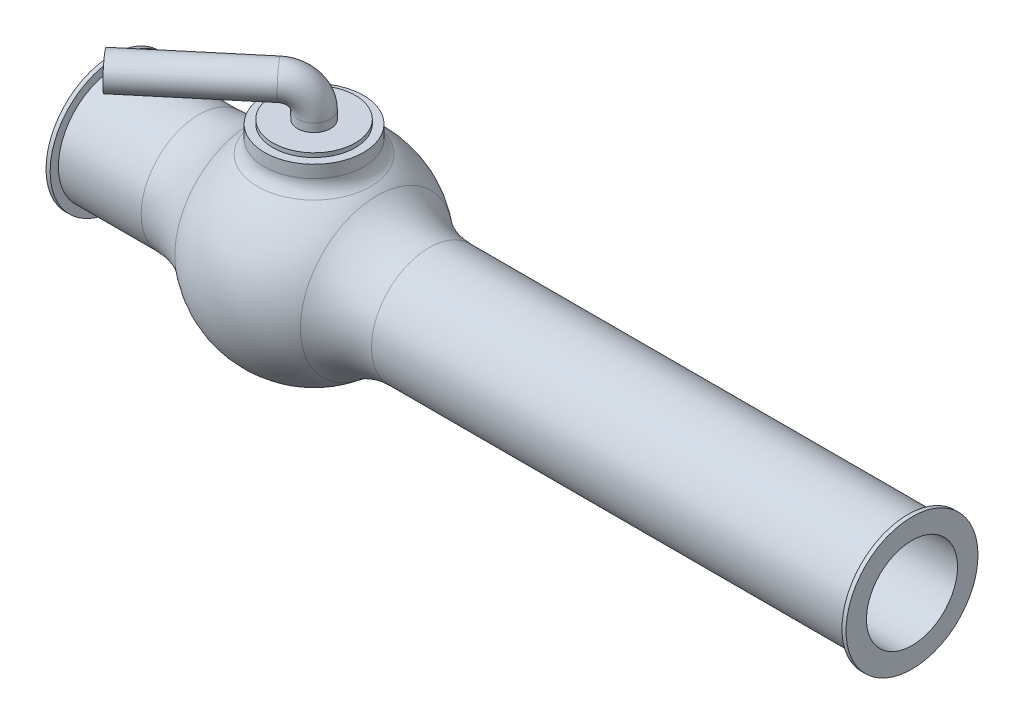
ISO-10303-21;
HEADER;
FILE_DESCRIPTION(('STEP AP214'),'2;1');
FILE_NAME('part.step','',(''),(''),'','','');
FILE_SCHEMA(('AUTOMOTIVE_DESIGN { 1 0 10303 214 1 1 1 1 }'));
ENDSEC;
DATA;
#1=APPLICATION_CONTEXT('core data for automotive mechanical design processes');
#2=APPLICATION_PROTOCOL_DEFINITION('international standard','automotive_design',2000,#1);
#3=PRODUCT_CONTEXT('',#1,'mechanical');
#4=PRODUCT('Part','Part','',(#3));
#5=PRODUCT_RELATED_PRODUCT_CATEGORY('part','',(#4));
#6=PRODUCT_DEFINITION_FORMATION('','',#4);
#7=PRODUCT_DEFINITION_CONTEXT('part definition',#1,'design');
#8=PRODUCT_DEFINITION('design','',#6,#7);
#9=PRODUCT_DEFINITION_SHAPE('','',#8);
#10=(LENGTH_UNIT() NAMED_UNIT(*) SI_UNIT(.MILLI.,.METRE.));
#11=(NAMED_UNIT(*) PLANE_ANGLE_UNIT() SI_UNIT($,.RADIAN.));
#12=(NAMED_UNIT(*) SI_UNIT($,.STERADIAN.) SOLID_ANGLE_UNIT());
#13=UNCERTAINTY_MEASURE_WITH_UNIT(LENGTH_MEASURE(1.E-05),#10,'distance_accuracy_value','');
#14=(GEOMETRIC_REPRESENTATION_CONTEXT(3) GLOBAL_UNCERTAINTY_ASSIGNED_CONTEXT((#13)) GLOBAL_UNIT_ASSIGNED_CONTEXT((#10,
#11,#12)) REPRESENTATION_CONTEXT('',''));
#15=CARTESIAN_POINT('',(0.,0.,0.));
#16=DIRECTION('',(0.,0.,1.));
#17=DIRECTION('',(1.,0.,0.));
#18=AXIS2_PLACEMENT_3D('',#15,#16,#17);
#19=CARTESIAN_POINT('',(0.,0.,0.));
#20=DIRECTION('',(0.,1.,0.));
#21=DIRECTION('',(0.,0.,-1.));
#22=AXIS2_PLACEMENT_3D('',#19,#20,#21);
#23=SPHERICAL_SURFACE('',#22,120.);
#24=CARTESIAN_POINT('',(0.,98.4782167977948,0.));
#25=DIRECTION('',(0.,-1.,0.));
#26=DIRECTION('',(0.,0.,-1.));
#27=AXIS2_PLACEMENT_3D('',#24,#25,#26);
#28=CIRCLE('',#27,68.5714285714286);
#29=CARTESIAN_POINT('',(0.,98.4782167977948,-68.5714285714286));
#30=VERTEX_POINT('',#29);
#31=EDGE_CURVE('E11',#30,#30,#28,.T.);
#32=ORIENTED_EDGE('',*,*,#31,.T.);
#33=EDGE_LOOP('',(#32));
#34=FACE_BOUND('',#33,.T.);
#35=CARTESIAN_POINT('',(76.1685820569215,0.,0.));
#36=DIRECTION('',(-1.,0.,0.));
#37=DIRECTION('',(0.,0.,1.));
#38=AXIS2_PLACEMENT_3D('',#35,#36,#37);
#39=CIRCLE('',#38,92.7272727272727);
#40=CARTESIAN_POINT('',(76.1685820569215,0.,92.7272727272727));
#41=VERTEX_POINT('',#40);
#42=EDGE_CURVE('E88',#41,#41,#39,.T.);
#43=ORIENTED_EDGE('',*,*,#42,.T.);
#44=EDGE_LOOP('',(#43));
#45=FACE_BOUND('',#44,.T.);
#46=CARTESIAN_POINT('',(-76.1685820569215,0.,0.));
#47=DIRECTION('',(1.,0.,0.));
#48=DIRECTION('',(0.,0.,-1.));
#49=AXIS2_PLACEMENT_3D('',#46,#47,#48);
#50=CIRCLE('',#49,92.7272727272727);
#51=CARTESIAN_POINT('',(-76.1685820569215,0.,-92.7272727272727));
#52=VERTEX_POINT('',#51);
#53=EDGE_CURVE('E81',#52,#52,#50,.T.);
#54=ORIENTED_EDGE('',*,*,#53,.T.);
#55=EDGE_LOOP('',(#54));
#56=FACE_BOUND('',#55,.T.);
#57=ADVANCED_FACE('F32',(#34,#45,#56),#23,.T.);
#58=CARTESIAN_POINT('',(0.,0.,0.));
#59=DIRECTION('',(0.,1.,0.));
#60=DIRECTION('',(0.,0.,-1.));
#61=AXIS2_PLACEMENT_3D('',#58,#59,#60);
#62=SPHERICAL_SURFACE('',#61,100.);
#63=CARTESIAN_POINT('',(-83.3885822273715,0.,0.));
#64=DIRECTION('',(1.,0.,0.));
#65=DIRECTION('',(0.,0.,-1.));
#66=AXIS2_PLACEMENT_3D('',#63,#64,#65);
#67=CIRCLE('',#66,55.1936985);
#68=CARTESIAN_POINT('',(-83.3885822273715,-46.099495348784,30.3509618084227));
#69=VERTEX_POINT('',#68);
#70=CARTESIAN_POINT('',(-83.3885822273715,46.0994953487841,30.3509618084227));
#71=VERTEX_POINT('',#70);
#72=EDGE_CURVE('E46',#69,#71,#67,.F.);
#73=ORIENTED_EDGE('',*,*,#72,.T.);
#74=CARTESIAN_POINT('',(-63.879360034848,0.,53.6011474450814));
#75=DIRECTION('',(0.766044443118979,0.,-0.642787609686538));
#76=DIRECTION('',(-0.642787609686538,0.,-0.766044443118979));
#77=AXIS2_PLACEMENT_3D('',#74,#75,#76);
#78=CIRCLE('',#77,55.1936985);
#79=EDGE_CURVE('E68',#71,#69,#78,.T.);
#80=ORIENTED_EDGE('',*,*,#79,.T.);
#81=EDGE_LOOP('',(#73,#80));
#82=FACE_BOUND('',#81,.T.);
#83=ADVANCED_FACE('F76',(#82),#62,.F.);
#84=CARTESIAN_POINT('',(0.,135.,0.));
#85=DIRECTION('',(0.,1.,0.));
#86=DIRECTION('',(0.,0.,1.));
#87=AXIS2_PLACEMENT_3D('',#84,#85,#86);
#88=PLANE('',#87);
#89=CARTESIAN_POINT('',(0.,135.,0.));
#90=DIRECTION('',(0.,1.,0.));
#91=DIRECTION('',(0.,0.,1.));
#92=AXIS2_PLACEMENT_3D('',#89,#90,#91);
#93=CIRCLE('',#92,50.);
#94=CARTESIAN_POINT('',(0.,135.,50.));
#95=VERTEX_POINT('',#94);
#96=EDGE_CURVE('E195',#95,#95,#93,.T.);
#97=ORIENTED_EDGE('',*,*,#96,.T.);
#98=EDGE_LOOP('',(#97));
#99=FACE_BOUND('',#98,.T.);
#100=CARTESIAN_POINT('',(0.,135.,0.));
#101=DIRECTION('',(0.,1.,0.));
#102=DIRECTION('',(0.,0.,1.));
#103=AXIS2_PLACEMENT_3D('',#100,#101,#102);
#104=CIRCLE('',#103,20.);
#105=CARTESIAN_POINT('',(0.,135.,20.));
#106=VERTEX_POINT('',#105);
#107=EDGE_CURVE('E184',#106,#106,#104,.T.);
#108=ORIENTED_EDGE('',*,*,#107,.F.);
#109=EDGE_LOOP('',(#108));
#110=FACE_BOUND('',#109,.T.);
#111=ADVANCED_FACE('F114',(#99,#110),#88,.T.);
#112=CARTESIAN_POINT('',(0.,135.,0.));
#113=DIRECTION('',(0.,-1.,0.));
#114=DIRECTION('',(0.,0.,-1.));
#115=AXIS2_PLACEMENT_3D('',#112,#113,#114);
#116=CYLINDRICAL_SURFACE('',#115,50.);
#117=ORIENTED_EDGE('',*,*,#96,.F.);
#118=EDGE_LOOP('',(#117));
#119=FACE_BOUND('',#118,.T.);
#120=CARTESIAN_POINT('',(0.,130.,0.));
#121=DIRECTION('',(0.,1.,0.));
#122=DIRECTION('',(0.,0.,1.));
#123=AXIS2_PLACEMENT_3D('',#120,#121,#122);
#124=CIRCLE('',#123,50.);
#125=CARTESIAN_POINT('',(0.,130.,50.));
#126=VERTEX_POINT('',#125);
#127=EDGE_CURVE('E181',#126,#126,#124,.T.);
#128=ORIENTED_EDGE('',*,*,#127,.T.);
#129=EDGE_LOOP('',(#128));
#130=FACE_BOUND('',#129,.T.);
#131=ADVANCED_FACE('F142',(#119,#130),#116,.T.);
#132=CARTESIAN_POINT('',(-22.9813332935695,175.,19.2836282905961));
#133=DIRECTION('',(-0.766044443118981,0.,0.642787609686535));
#134=DIRECTION('',(0.642787609686535,0.,0.766044443118982));
#135=AXIS2_PLACEMENT_3D('',#132,#133,#134);
#136=CYLINDRICAL_SURFACE('',#135,20.);
#137=CARTESIAN_POINT('',(-22.9813332935695,175.,19.2836282905961));
#138=DIRECTION('',(-0.766044443118982,0.,0.642787609686535));
#139=DIRECTION('',(0.492403876506103,-0.642787609686535,0.586824088833471));
#140=AXIS2_PLACEMENT_3D('',#137,#138,#139);
#141=CIRCLE('',#140,20.);
#142=CARTESIAN_POINT('',(-22.9813332935695,195.,19.2836282905961));
#143=VERTEX_POINT('',#142);
#144=EDGE_CURVE('E188',#143,#143,#141,.T.);
#145=ORIENTED_EDGE('',*,*,#144,.T.);
#146=EDGE_LOOP('',(#145));
#147=FACE_BOUND('',#146,.T.);
#148=CARTESIAN_POINT('',(-137.887999761417,175.,115.701769743576));
#149=DIRECTION('',(-0.766044443118982,0.,0.642787609686535));
#150=DIRECTION('',(0.492403876506103,-0.642787609686535,0.586824088833471));
#151=AXIS2_PLACEMENT_3D('',#148,#149,#150);
#152=CIRCLE('',#151,20.);
#153=CARTESIAN_POINT('',(-128.039922231295,162.144247806269,127.438251520246));
#154=VERTEX_POINT('',#153);
#155=EDGE_CURVE('E193',#154,#154,#152,.T.);
#156=ORIENTED_EDGE('',*,*,#155,.F.);
#157=EDGE_LOOP('',(#156));
#158=FACE_BOUND('',#157,.T.);
#159=ADVANCED_FACE('F138',(#147,#158),#136,.T.);
#160=CARTESIAN_POINT('',(-22.9813332935694,145.,19.2836282905961));
#161=DIRECTION('',(0.642787609686535,0.,0.766044443118982));
#162=DIRECTION('',(0.766044443118982,0.,-0.642787609686535));
#163=AXIS2_PLACEMENT_3D('',#160,#161,#162);
#164=TOROIDAL_SURFACE('',#163,30.,20.);
#165=CARTESIAN_POINT('',(0.,145.,0.));
#166=DIRECTION('',(0.,1.,0.));
#167=DIRECTION('',(0.,0.,1.));
#168=AXIS2_PLACEMENT_3D('',#165,#166,#167);
#169=CIRCLE('',#168,20.);
#170=CARTESIAN_POINT('',(15.3208888623796,145.,-12.8557521937307));
#171=VERTEX_POINT('',#170);
#172=EDGE_CURVE('E185',#171,#171,#169,.T.);
#173=CARTESIAN_POINT('',(-22.9813332935694,145.,19.2836282905961));
#174=DIRECTION('',(0.642787609686535,0.,0.766044443118982));
#175=DIRECTION('',(0.766044443118982,0.,-0.642787609686535));
#176=AXIS2_PLACEMENT_3D('',#173,#174,#175);
#177=CIRCLE('',#176,50.);
#178=EDGE_CURVE('',#171,#143,#177,.T.);
#179=ORIENTED_EDGE('',*,*,#172,.T.);
#180=ORIENTED_EDGE('',*,*,#144,.F.);
#181=ORIENTED_EDGE('',*,*,#178,.T.);
#182=ORIENTED_EDGE('',*,*,#178,.F.);
#183=EDGE_LOOP('',(#179,#181,#180,#182));
#184=FACE_BOUND('',#183,.T.);
#185=ADVANCED_FACE('F134',(#184),#164,.T.);
#186=CARTESIAN_POINT('',(0.,145.,0.));
#187=DIRECTION('',(0.,-1.,0.));
#188=DIRECTION('',(0.,0.,-1.));
#189=AXIS2_PLACEMENT_3D('',#186,#187,#188);
#190=CYLINDRICAL_SURFACE('',#189,20.);
#191=ORIENTED_EDGE('',*,*,#172,.F.);
#192=EDGE_LOOP('',(#191));
#193=FACE_BOUND('',#192,.T.);
#194=ORIENTED_EDGE('',*,*,#107,.T.);
#195=EDGE_LOOP('',(#194));
#196=FACE_BOUND('',#195,.T.);
#197=ADVANCED_FACE('F130',(#193,#196),#190,.T.);
#198=CARTESIAN_POINT('',(-137.887999761417,175.,115.701769743576));
#199=DIRECTION('',(-0.766044443118982,0.,0.642787609686535));
#200=DIRECTION('',(0.492403876506103,-0.642787609686535,0.586824088833471));
#201=AXIS2_PLACEMENT_3D('',#198,#199,#200);
#202=PLANE('',#201);
#203=ORIENTED_EDGE('',*,*,#155,.T.);
#204=EDGE_LOOP('',(#203));
#205=FACE_BOUND('',#204,.T.);
#206=ADVANCED_FACE('F123',(#205),#202,.T.);
#207=CARTESIAN_POINT('',(0.,180.,0.));
#208=DIRECTION('',(0.,1.,0.));
#209=DIRECTION('',(0.,0.,1.));
#210=AXIS2_PLACEMENT_3D('',#207,#208,#209);
#211=CYLINDRICAL_SURFACE('',#210,60.);
#212=CARTESIAN_POINT('',(0.,114.891252930761,0.));
#213=DIRECTION('',(0.,-1.,0.));
#214=DIRECTION('',(0.,0.,-1.));
#215=AXIS2_PLACEMENT_3D('',#212,#213,#214);
#216=CIRCLE('',#215,60.);
#217=CARTESIAN_POINT('',(0.,114.891252930761,-60.));
#218=VERTEX_POINT('',#217);
#219=EDGE_CURVE('E40',#218,#218,#216,.F.);
#220=ORIENTED_EDGE('',*,*,#219,.T.);
#221=EDGE_LOOP('',(#220));
#222=FACE_BOUND('',#221,.T.);
#223=CARTESIAN_POINT('',(0.,130.,0.));
#224=DIRECTION('',(0.,1.,0.));
#225=DIRECTION('',(0.,0.,1.));
#226=AXIS2_PLACEMENT_3D('',#223,#224,#225);
#227=CIRCLE('',#226,60.);
#228=CARTESIAN_POINT('',(0.,130.,60.));
#229=VERTEX_POINT('',#228);
#230=EDGE_CURVE('E178',#229,#229,#227,.T.);
#231=ORIENTED_EDGE('',*,*,#230,.F.);
#232=EDGE_LOOP('',(#231));
#233=FACE_BOUND('',#232,.T.);
#234=ADVANCED_FACE('F96',(#222,#233),#211,.T.);
#235=CARTESIAN_POINT('',(0.,130.,-40.));
#236=DIRECTION('',(0.,1.,0.));
#237=DIRECTION('',(0.,0.,1.));
#238=AXIS2_PLACEMENT_3D('',#235,#236,#237);
#239=PLANE('',#238);
#240=ORIENTED_EDGE('',*,*,#230,.T.);
#241=EDGE_LOOP('',(#240));
#242=FACE_BOUND('',#241,.T.);
#243=ORIENTED_EDGE('',*,*,#127,.F.);
#244=EDGE_LOOP('',(#243));
#245=FACE_BOUND('',#244,.T.);
#246=ADVANCED_FACE('F122',(#242,#245),#239,.T.);
#247=CARTESIAN_POINT('',(-150.744751955147,0.,0.));
#248=DIRECTION('',(1.,0.,0.));
#249=DIRECTION('',(0.,0.,-1.));
#250=AXIS2_PLACEMENT_3D('',#247,#248,#249);
#251=CYLINDRICAL_SURFACE('',#250,70.);
#252=CARTESIAN_POINT('',(139.642400437689,0.,0.));
#253=DIRECTION('',(-1.,0.,0.));
#254=DIRECTION('',(0.,0.,1.));
#255=AXIS2_PLACEMENT_3D('',#252,#253,#254);
#256=CIRCLE('',#255,70.);
#257=CARTESIAN_POINT('',(139.642400437689,0.,70.));
#258=VERTEX_POINT('',#257);
#259=EDGE_CURVE('E79',#258,#258,#256,.F.);
#260=ORIENTED_EDGE('',*,*,#259,.T.);
#261=EDGE_LOOP('',(#260));
#262=FACE_BOUND('',#261,.T.);
#263=CARTESIAN_POINT('',(720.,0.,0.));
#264=DIRECTION('',(1.,0.,0.));
#265=DIRECTION('',(0.,0.,-1.));
#266=AXIS2_PLACEMENT_3D('',#263,#264,#265);
#267=CIRCLE('',#266,70.);
#268=CARTESIAN_POINT('',(720.,0.,-70.));
#269=VERTEX_POINT('',#268);
#270=EDGE_CURVE('E77',#269,#269,#267,.T.);
#271=ORIENTED_EDGE('',*,*,#270,.F.);
#272=EDGE_LOOP('',(#271));
#273=FACE_BOUND('',#272,.T.);
#274=ADVANCED_FACE('F126',(#262,#273),#251,.T.);
#275=CARTESIAN_POINT('',(107.922796533957,0.,-90.5579787672637));
#276=DIRECTION('',(-0.766044443118979,0.,0.642787609686538));
#277=DIRECTION('',(0.642787609686538,0.,0.766044443118979));
#278=AXIS2_PLACEMENT_3D('',#275,#276,#277);
#279=CYLINDRICAL_SURFACE('',#278,55.1936985);
#280=CARTESIAN_POINT('',(63.879360034848,0.,-53.6011474450815));
#281=DIRECTION('',(-0.766044443118979,0.,0.642787609686538));
#282=DIRECTION('',(0.642787609686538,0.,0.766044443118979));
#283=AXIS2_PLACEMENT_3D('',#280,#281,#282);
#284=CIRCLE('',#283,55.1936985);
#285=CARTESIAN_POINT('',(83.3885822273715,46.099495348784,-30.3509618084229));
#286=VERTEX_POINT('',#285);
#287=CARTESIAN_POINT('',(83.3885822273715,-46.0994953487841,-30.3509618084228));
#288=VERTEX_POINT('',#287);
#289=EDGE_CURVE('E69',#286,#288,#284,.T.);
#290=ORIENTED_EDGE('',*,*,#289,.F.);
#291=EDGE_CURVE('E197',#288,#286,#284,.T.);
#292=ORIENTED_EDGE('',*,*,#291,.F.);
#293=EDGE_LOOP('',(#290,#292));
#294=FACE_BOUND('',#293,.T.);
#295=ORIENTED_EDGE('',*,*,#79,.F.);
#296=EDGE_CURVE('E62',#69,#71,#78,.T.);
#297=ORIENTED_EDGE('',*,*,#296,.F.);
#298=EDGE_LOOP('',(#295,#297));
#299=FACE_BOUND('',#298,.T.);
#300=ADVANCED_FACE('F78',(#294,#299),#279,.F.);
#301=CARTESIAN_POINT('',(0.,0.,0.));
#302=DIRECTION('',(0.,1.,0.));
#303=DIRECTION('',(0.,0.,-1.));
#304=AXIS2_PLACEMENT_3D('',#301,#302,#303);
#305=SPHERICAL_SURFACE('',#304,100.);
#306=ORIENTED_EDGE('',*,*,#291,.T.);
#307=CARTESIAN_POINT('',(83.3885822273715,0.,0.));
#308=DIRECTION('',(-1.,0.,0.));
#309=DIRECTION('',(0.,0.,1.));
#310=AXIS2_PLACEMENT_3D('',#307,#308,#309);
#311=CIRCLE('',#310,55.1936985);
#312=EDGE_CURVE('E173',#288,#286,#311,.T.);
#313=ORIENTED_EDGE('',*,*,#312,.F.);
#314=EDGE_LOOP('',(#306,#313));
#315=FACE_BOUND('',#314,.T.);
#316=ADVANCED_FACE('F152',(#315),#305,.T.);
#317=ORIENTED_EDGE('',*,*,#289,.T.);
#318=EDGE_CURVE('E53',#286,#288,#311,.T.);
#319=ORIENTED_EDGE('',*,*,#318,.F.);
#320=EDGE_LOOP('',(#317,#319));
#321=FACE_BOUND('',#320,.T.);
#322=ADVANCED_FACE('F116',(#321),#62,.F.);
#323=CARTESIAN_POINT('',(-150.744751955147,0.,0.));
#324=DIRECTION('',(1.,0.,0.));
#325=DIRECTION('',(0.,0.,-1.));
#326=AXIS2_PLACEMENT_3D('',#323,#324,#325);
#327=CYLINDRICAL_SURFACE('',#326,55.1936985);
#328=ORIENTED_EDGE('',*,*,#318,.T.);
#329=ORIENTED_EDGE('',*,*,#312,.T.);
#330=EDGE_LOOP('',(#328,#329));
#331=FACE_BOUND('',#330,.T.);
#332=CARTESIAN_POINT('',(725.,0.,0.));
#333=DIRECTION('',(1.,0.,0.));
#334=DIRECTION('',(0.,0.,-1.));
#335=AXIS2_PLACEMENT_3D('',#332,#333,#334);
#336=CIRCLE('',#335,55.1936985);
#337=CARTESIAN_POINT('',(725.,0.,-55.1936985));
#338=VERTEX_POINT('',#337);
#339=EDGE_CURVE('E257',#338,#338,#336,.T.);
#340=ORIENTED_EDGE('',*,*,#339,.T.);
#341=EDGE_LOOP('',(#340));
#342=FACE_BOUND('',#341,.T.);
#343=ADVANCED_FACE('F205',(#331,#342),#327,.F.);
#344=CARTESIAN_POINT('',(0.,0.,0.));
#345=DIRECTION('',(0.,1.,0.));
#346=DIRECTION('',(0.,0.,-1.));
#347=AXIS2_PLACEMENT_3D('',#344,#345,#346);
#348=SPHERICAL_SURFACE('',#347,100.);
#349=ORIENTED_EDGE('',*,*,#296,.T.);
#350=EDGE_CURVE('E64',#71,#69,#67,.F.);
#351=ORIENTED_EDGE('',*,*,#350,.T.);
#352=EDGE_LOOP('',(#349,#351));
#353=FACE_BOUND('',#352,.T.);
#354=ADVANCED_FACE('F63',(#353),#348,.T.);
#355=CARTESIAN_POINT('',(720.001,0.,0.));
#356=DIRECTION('',(-1.,0.,0.));
#357=DIRECTION('',(0.,0.,1.));
#358=AXIS2_PLACEMENT_3D('',#355,#356,#357);
#359=CYLINDRICAL_SURFACE('',#358,55.1936985);
#360=ORIENTED_EDGE('',*,*,#72,.F.);
#361=ORIENTED_EDGE('',*,*,#350,.F.);
#362=EDGE_LOOP('',(#360,#361));
#363=FACE_BOUND('',#362,.T.);
#364=CARTESIAN_POINT('',(-245.,0.,0.));
#365=DIRECTION('',(-1.,0.,0.));
#366=DIRECTION('',(0.,0.,1.));
#367=AXIS2_PLACEMENT_3D('',#364,#365,#366);
#368=CIRCLE('',#367,55.1936985);
#369=CARTESIAN_POINT('',(-245.,0.,55.1936985));
#370=VERTEX_POINT('',#369);
#371=EDGE_CURVE('E247',#370,#370,#368,.T.);
#372=ORIENTED_EDGE('',*,*,#371,.T.);
#373=EDGE_LOOP('',(#372));
#374=FACE_BOUND('',#373,.T.);
#375=ADVANCED_FACE('F71',(#363,#374),#359,.F.);
#376=CARTESIAN_POINT('',(720.001,0.,0.));
#377=DIRECTION('',(-1.,0.,0.));
#378=DIRECTION('',(0.,0.,1.));
#379=AXIS2_PLACEMENT_3D('',#376,#377,#378);
#380=CYLINDRICAL_SURFACE('',#379,70.);
#381=CARTESIAN_POINT('',(-139.642400437689,0.,0.));
#382=DIRECTION('',(1.,0.,0.));
#383=DIRECTION('',(0.,0.,-1.));
#384=AXIS2_PLACEMENT_3D('',#381,#382,#383);
#385=CIRCLE('',#384,70.);
#386=CARTESIAN_POINT('',(-139.642400437689,0.,-70.));
#387=VERTEX_POINT('',#386);
#388=EDGE_CURVE('E91',#387,#387,#385,.F.);
#389=ORIENTED_EDGE('',*,*,#388,.T.);
#390=EDGE_LOOP('',(#389));
#391=FACE_BOUND('',#390,.T.);
#392=CARTESIAN_POINT('',(-240.,0.,0.));
#393=DIRECTION('',(-1.,0.,0.));
#394=DIRECTION('',(0.,0.,1.));
#395=AXIS2_PLACEMENT_3D('',#392,#393,#394);
#396=CIRCLE('',#395,70.);
#397=CARTESIAN_POINT('',(-240.,0.,70.));
#398=VERTEX_POINT('',#397);
#399=EDGE_CURVE('E253',#398,#398,#396,.T.);
#400=ORIENTED_EDGE('',*,*,#399,.F.);
#401=EDGE_LOOP('',(#400));
#402=FACE_BOUND('',#401,.T.);
#403=ADVANCED_FACE('F218',(#391,#402),#380,.T.);
#404=CARTESIAN_POINT('',(725.,0.,0.));
#405=DIRECTION('',(1.,0.,0.));
#406=DIRECTION('',(0.,0.,-1.));
#407=AXIS2_PLACEMENT_3D('',#404,#405,#406);
#408=PLANE('',#407);
#409=CARTESIAN_POINT('',(725.,0.,0.));
#410=DIRECTION('',(1.,0.,0.));
#411=DIRECTION('',(0.,0.,-1.));
#412=AXIS2_PLACEMENT_3D('',#409,#410,#411);
#413=CIRCLE('',#412,80.);
#414=CARTESIAN_POINT('',(725.,0.,-80.));
#415=VERTEX_POINT('',#414);
#416=EDGE_CURVE('E73',#415,#415,#413,.T.);
#417=ORIENTED_EDGE('',*,*,#416,.T.);
#418=EDGE_LOOP('',(#417));
#419=FACE_BOUND('',#418,.T.);
#420=ORIENTED_EDGE('',*,*,#339,.F.);
#421=EDGE_LOOP('',(#420));
#422=FACE_BOUND('',#421,.T.);
#423=ADVANCED_FACE('F221',(#419,#422),#408,.T.);
#424=CARTESIAN_POINT('',(720.,0.,0.));
#425=DIRECTION('',(1.,0.,0.));
#426=DIRECTION('',(0.,0.,-1.));
#427=AXIS2_PLACEMENT_3D('',#424,#425,#426);
#428=PLANE('',#427);
#429=ORIENTED_EDGE('',*,*,#270,.T.);
#430=EDGE_LOOP('',(#429));
#431=FACE_BOUND('',#430,.T.);
#432=CARTESIAN_POINT('',(720.,0.,0.));
#433=DIRECTION('',(1.,0.,0.));
#434=DIRECTION('',(0.,0.,-1.));
#435=AXIS2_PLACEMENT_3D('',#432,#433,#434);
#436=CIRCLE('',#435,80.);
#437=CARTESIAN_POINT('',(720.,0.,-80.));
#438=VERTEX_POINT('',#437);
#439=EDGE_CURVE('E260',#438,#438,#436,.T.);
#440=ORIENTED_EDGE('',*,*,#439,.F.);
#441=EDGE_LOOP('',(#440));
#442=FACE_BOUND('',#441,.T.);
#443=ADVANCED_FACE('F227',(#431,#442),#428,.F.);
#444=CARTESIAN_POINT('',(725.,0.,0.));
#445=DIRECTION('',(-1.,0.,0.));
#446=DIRECTION('',(0.,0.,1.));
#447=AXIS2_PLACEMENT_3D('',#444,#445,#446);
#448=CYLINDRICAL_SURFACE('',#447,80.);
#449=ORIENTED_EDGE('',*,*,#416,.F.);
#450=EDGE_LOOP('',(#449));
#451=FACE_BOUND('',#450,.T.);
#452=ORIENTED_EDGE('',*,*,#439,.T.);
#453=EDGE_LOOP('',(#452));
#454=FACE_BOUND('',#453,.T.);
#455=ADVANCED_FACE('F223',(#451,#454),#448,.T.);
#456=CARTESIAN_POINT('',(-240.,0.,0.));
#457=DIRECTION('',(-1.,0.,0.));
#458=DIRECTION('',(0.,0.,1.));
#459=AXIS2_PLACEMENT_3D('',#456,#457,#458);
#460=PLANE('',#459);
#461=CARTESIAN_POINT('',(-240.,0.,0.));
#462=DIRECTION('',(-1.,0.,0.));
#463=DIRECTION('',(0.,0.,1.));
#464=AXIS2_PLACEMENT_3D('',#461,#462,#463);
#465=CIRCLE('',#464,80.);
#466=CARTESIAN_POINT('',(-240.,0.,80.));
#467=VERTEX_POINT('',#466);
#468=EDGE_CURVE('E248',#467,#467,#465,.T.);
#469=ORIENTED_EDGE('',*,*,#468,.F.);
#470=EDGE_LOOP('',(#469));
#471=FACE_BOUND('',#470,.T.);
#472=ORIENTED_EDGE('',*,*,#399,.T.);
#473=EDGE_LOOP('',(#472));
#474=FACE_BOUND('',#473,.T.);
#475=ADVANCED_FACE('F226',(#471,#474),#460,.F.);
#476=CARTESIAN_POINT('',(-245.,0.,0.));
#477=DIRECTION('',(-1.,0.,0.));
#478=DIRECTION('',(0.,0.,1.));
#479=AXIS2_PLACEMENT_3D('',#476,#477,#478);
#480=PLANE('',#479);
#481=CARTESIAN_POINT('',(-245.,0.,0.));
#482=DIRECTION('',(-1.,0.,0.));
#483=DIRECTION('',(0.,0.,1.));
#484=AXIS2_PLACEMENT_3D('',#481,#482,#483);
#485=CIRCLE('',#484,80.);
#486=CARTESIAN_POINT('',(-245.,0.,80.));
#487=VERTEX_POINT('',#486);
#488=EDGE_CURVE('E244',#487,#487,#485,.T.);
#489=ORIENTED_EDGE('',*,*,#488,.T.);
#490=EDGE_LOOP('',(#489));
#491=FACE_BOUND('',#490,.T.);
#492=ORIENTED_EDGE('',*,*,#371,.F.);
#493=EDGE_LOOP('',(#492));
#494=FACE_BOUND('',#493,.T.);
#495=ADVANCED_FACE('F160',(#491,#494),#480,.T.);
#496=CARTESIAN_POINT('',(-245.,0.,0.));
#497=DIRECTION('',(1.,0.,0.));
#498=DIRECTION('',(0.,0.,-1.));
#499=AXIS2_PLACEMENT_3D('',#496,#497,#498);
#500=CYLINDRICAL_SURFACE('',#499,80.);
#501=ORIENTED_EDGE('',*,*,#488,.F.);
#502=EDGE_LOOP('',(#501));
#503=FACE_BOUND('',#502,.T.);
#504=ORIENTED_EDGE('',*,*,#468,.T.);
#505=EDGE_LOOP('',(#504));
#506=FACE_BOUND('',#505,.T.);
#507=ADVANCED_FACE('F155',(#503,#506),#500,.T.);
#508=CARTESIAN_POINT('',(139.642400437689,0.,0.));
#509=DIRECTION('',(-1.,0.,0.));
#510=DIRECTION('',(0.,0.,1.));
#511=AXIS2_PLACEMENT_3D('',#508,#509,#510);
#512=TOROIDAL_SURFACE('',#511,170.,100.);
#513=ORIENTED_EDGE('',*,*,#42,.F.);
#514=EDGE_LOOP('',(#513));
#515=FACE_BOUND('',#514,.T.);
#516=ORIENTED_EDGE('',*,*,#259,.F.);
#517=EDGE_LOOP('',(#516));
#518=FACE_BOUND('',#517,.T.);
#519=ADVANCED_FACE('F105',(#515,#518),#512,.F.);
#520=CARTESIAN_POINT('',(-139.642400437689,0.,0.));
#521=DIRECTION('',(1.,0.,0.));
#522=DIRECTION('',(0.,0.,-1.));
#523=AXIS2_PLACEMENT_3D('',#520,#521,#522);
#524=TOROIDAL_SURFACE('',#523,170.,100.);
#525=ORIENTED_EDGE('',*,*,#53,.F.);
#526=EDGE_LOOP('',(#525));
#527=FACE_BOUND('',#526,.T.);
#528=ORIENTED_EDGE('',*,*,#388,.F.);
#529=EDGE_LOOP('',(#528));
#530=FACE_BOUND('',#529,.T.);
#531=ADVANCED_FACE('F100',(#527,#530),#524,.F.);
#532=CARTESIAN_POINT('',(0.,114.891252930761,0.));
#533=DIRECTION('',(0.,-1.,0.));
#534=DIRECTION('',(0.,0.,-1.));
#535=AXIS2_PLACEMENT_3D('',#532,#533,#534);
#536=TOROIDAL_SURFACE('',#535,80.,20.);
#537=ORIENTED_EDGE('',*,*,#31,.F.);
#538=EDGE_LOOP('',(#537));
#539=FACE_BOUND('',#538,.T.);
#540=ORIENTED_EDGE('',*,*,#219,.F.);
#541=EDGE_LOOP('',(#540));
#542=FACE_BOUND('',#541,.T.);
#543=ADVANCED_FACE('F34',(#539,#542),#536,.F.);
#544=CLOSED_SHELL('',(#57,#83,#111,#131,#159,#185,#197,#206,#234,#246,#274,#300,#316,#322,#343,
#354,#375,#403,#423,#443,#455,#475,#495,#507,#519,#531,#543));
#545=MANIFOLD_SOLID_BREP('B2',#544);
#546=ADVANCED_BREP_SHAPE_REPRESENTATION('',(#18,#545),#14);
#547=SHAPE_DEFINITION_REPRESENTATION(#9,#546);
ENDSEC;
END-ISO-10303-21;
